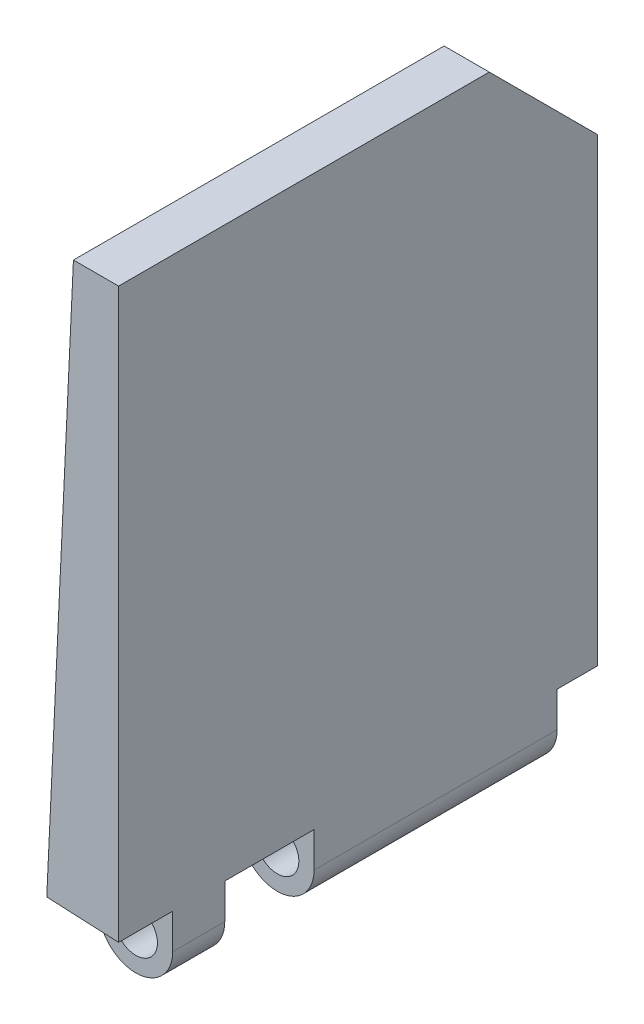
ISO-10303-21;
HEADER;
FILE_DESCRIPTION(('STEP AP214'),'2;1');
FILE_NAME('part.step','',(''),(''),'','','');
FILE_SCHEMA(('AUTOMOTIVE_DESIGN { 1 0 10303 214 1 1 1 1 }'));
ENDSEC;
DATA;
#1=APPLICATION_CONTEXT('core data for automotive mechanical design processes');
#2=APPLICATION_PROTOCOL_DEFINITION('international standard','automotive_design',2000,#1);
#3=PRODUCT_CONTEXT('',#1,'mechanical');
#4=PRODUCT('Part','Part','',(#3));
#5=PRODUCT_RELATED_PRODUCT_CATEGORY('part','',(#4));
#6=PRODUCT_DEFINITION_FORMATION('','',#4);
#7=PRODUCT_DEFINITION_CONTEXT('part definition',#1,'design');
#8=PRODUCT_DEFINITION('design','',#6,#7);
#9=PRODUCT_DEFINITION_SHAPE('','',#8);
#10=(LENGTH_UNIT() NAMED_UNIT(*) SI_UNIT(.MILLI.,.METRE.));
#11=(NAMED_UNIT(*) PLANE_ANGLE_UNIT() SI_UNIT($,.RADIAN.));
#12=(NAMED_UNIT(*) SI_UNIT($,.STERADIAN.) SOLID_ANGLE_UNIT());
#13=UNCERTAINTY_MEASURE_WITH_UNIT(LENGTH_MEASURE(1.E-05),#10,'distance_accuracy_value','');
#14=(GEOMETRIC_REPRESENTATION_CONTEXT(3) GLOBAL_UNCERTAINTY_ASSIGNED_CONTEXT((#13)) GLOBAL_UNIT_ASSIGNED_CONTEXT((#10,
#11,#12)) REPRESENTATION_CONTEXT('',''));
#15=CARTESIAN_POINT('',(0.,0.,0.));
#16=DIRECTION('',(0.,0.,1.));
#17=DIRECTION('',(1.,0.,0.));
#18=AXIS2_PLACEMENT_3D('',#15,#16,#17);
#19=CARTESIAN_POINT('',(-5.9368100641537,148.296821956492,-22.52));
#20=DIRECTION('',(0.,0.,-1.));
#21=DIRECTION('',(1.,0.,0.));
#22=AXIS2_PLACEMENT_3D('',#19,#20,#21);
#23=CYLINDRICAL_SURFACE('',#22,1.73219883235693);
#24=CARTESIAN_POINT('',(-5.9368100641537,148.296821956492,-31.7169488797652));
#25=DIRECTION('',(0.,0.,1.));
#26=DIRECTION('',(1.,0.,0.));
#27=AXIS2_PLACEMENT_3D('',#24,#25,#26);
#28=CIRCLE('',#27,1.73219883235693);
#29=CARTESIAN_POINT('',(-4.20461123179677,148.296821956492,-31.7169488797652));
#30=VERTEX_POINT('',#29);
#31=CARTESIAN_POINT('',(-7.66707712949073,148.378606291354,-31.7169488797652));
#32=VERTEX_POINT('',#31);
#33=EDGE_CURVE('E171',#30,#32,#28,.F.);
#34=ORIENTED_EDGE('',*,*,#33,.T.);
#35=DIRECTION('',(0.,0.,-1.));
#36=VECTOR('',#35,1.);
#37=CARTESIAN_POINT('',(-7.66707712949072,148.378606291354,-22.52));
#38=LINE('',#37,#36);
#39=CARTESIAN_POINT('',(-7.66707712949073,148.378606291354,-43.1553405109939));
#40=VERTEX_POINT('',#39);
#41=EDGE_CURVE('E204',#32,#40,#38,.T.);
#42=ORIENTED_EDGE('',*,*,#41,.T.);
#43=CARTESIAN_POINT('',(-5.9368100641537,148.296821956492,-43.1553405109939));
#44=DIRECTION('',(0.,0.,-1.));
#45=DIRECTION('',(0.,1.,0.));
#46=AXIS2_PLACEMENT_3D('',#43,#44,#45);
#47=CIRCLE('',#46,1.73219883235693);
#48=CARTESIAN_POINT('',(-4.20461123179677,148.296821956492,-43.1553405109939));
#49=VERTEX_POINT('',#48);
#50=EDGE_CURVE('E188',#40,#49,#47,.F.);
#51=ORIENTED_EDGE('',*,*,#50,.T.);
#52=DIRECTION('',(0.,0.,-1.));
#53=VECTOR('',#52,1.);
#54=CARTESIAN_POINT('',(-4.20461123179677,148.296821956492,-22.52));
#55=LINE('',#54,#53);
#56=EDGE_CURVE('E199',#30,#49,#55,.T.);
#57=ORIENTED_EDGE('',*,*,#56,.F.);
#58=EDGE_LOOP('',(#34,#42,#51,#57));
#59=FACE_BOUND('',#58,.T.);
#60=ADVANCED_FACE('F30',(#59),#23,.T.);
#61=CARTESIAN_POINT('',(-5.9368100641537,148.296821956492,-25.0631857722265));
#62=DIRECTION('',(0.,0.,1.));
#63=DIRECTION('',(1.,0.,0.));
#64=AXIS2_PLACEMENT_3D('',#61,#62,#63);
#65=CIRCLE('',#64,1.73219883235693);
#66=CARTESIAN_POINT('',(-4.20461123179677,148.296821956492,-25.0631857722265));
#67=VERTEX_POINT('',#66);
#68=CARTESIAN_POINT('',(-7.66707712949073,148.378606291354,-25.0631857722265));
#69=VERTEX_POINT('',#68);
#70=EDGE_CURVE('E158',#67,#69,#65,.F.);
#71=ORIENTED_EDGE('',*,*,#70,.T.);
#72=CARTESIAN_POINT('',(-7.66707712949073,148.378606291354,-27.5150907295179));
#73=VERTEX_POINT('',#72);
#74=EDGE_CURVE('E148',#69,#73,#38,.T.);
#75=ORIENTED_EDGE('',*,*,#74,.T.);
#76=CARTESIAN_POINT('',(-5.9368100641537,148.296821956492,-27.5150907295179));
#77=DIRECTION('',(0.,0.,-1.));
#78=DIRECTION('',(-1.,0.,0.));
#79=AXIS2_PLACEMENT_3D('',#76,#77,#78);
#80=CIRCLE('',#79,1.73219883235693);
#81=CARTESIAN_POINT('',(-4.20461123179677,148.296821956492,-27.5150907295179));
#82=VERTEX_POINT('',#81);
#83=EDGE_CURVE('E175',#73,#82,#80,.F.);
#84=ORIENTED_EDGE('',*,*,#83,.T.);
#85=EDGE_CURVE('E210',#67,#82,#55,.T.);
#86=ORIENTED_EDGE('',*,*,#85,.F.);
#87=EDGE_LOOP('',(#71,#75,#84,#86));
#88=FACE_BOUND('',#87,.T.);
#89=ADVANCED_FACE('F273',(#88),#23,.T.);
#90=CARTESIAN_POINT('',(-7.66707712949072,148.378606291354,-22.52));
#91=DIRECTION('',(-0.998884789099364,0.0472141727230132,0.));
#92=DIRECTION('',(-0.0472141727230132,-0.998884789099364,0.));
#93=AXIS2_PLACEMENT_3D('',#90,#91,#92);
#94=PLANE('',#93);
#95=DIRECTION('',(-0.0472141727230132,-0.998884789099364,0.));
#96=VECTOR('',#95,1.);
#97=CARTESIAN_POINT('',(-7.66707712949072,148.378606291354,-45.04));
#98=LINE('',#97,#96);
#99=CARTESIAN_POINT('',(-6.56899797373491,171.610074781681,-45.04));
#100=VERTEX_POINT('',#99);
#101=CARTESIAN_POINT('',(-7.58529279462923,150.108873356691,-45.04));
#102=VERTEX_POINT('',#101);
#103=EDGE_CURVE('E195',#100,#102,#98,.T.);
#104=ORIENTED_EDGE('',*,*,#103,.T.);
#105=DIRECTION('',(0.,0.,1.));
#106=VECTOR('',#105,1.);
#107=CARTESIAN_POINT('',(-7.58529279462923,150.108873356691,-43.1553405109939));
#108=LINE('',#107,#106);
#109=CARTESIAN_POINT('',(-7.58529279462923,150.108873356691,-43.1553405109939));
#110=VERTEX_POINT('',#109);
#111=EDGE_CURVE('E180',#102,#110,#108,.T.);
#112=ORIENTED_EDGE('',*,*,#111,.T.);
#113=DIRECTION('',(-0.0472141727230132,-0.998884789099364,0.));
#114=VECTOR('',#113,1.);
#115=CARTESIAN_POINT('',(-7.74886146435224,146.648339226017,-43.1553405109939));
#116=LINE('',#115,#114);
#117=EDGE_CURVE('E178',#110,#40,#116,.T.);
#118=ORIENTED_EDGE('',*,*,#117,.T.);
#119=ORIENTED_EDGE('',*,*,#41,.F.);
#120=DIRECTION('',(0.0472141727230132,0.998884789099364,0.));
#121=VECTOR('',#120,1.);
#122=CARTESIAN_POINT('',(-7.74886146435224,146.648339226017,-31.7169488797652));
#123=LINE('',#122,#121);
#124=CARTESIAN_POINT('',(-7.58529279462923,150.108873356691,-31.7169488797652));
#125=VERTEX_POINT('',#124);
#126=EDGE_CURVE('E162',#32,#125,#123,.T.);
#127=ORIENTED_EDGE('',*,*,#126,.T.);
#128=DIRECTION('',(0.,0.,1.));
#129=VECTOR('',#128,1.);
#130=CARTESIAN_POINT('',(-7.58529279462923,150.108873356691,-27.5150907295179));
#131=LINE('',#130,#129);
#132=CARTESIAN_POINT('',(-7.58529279462923,150.108873356691,-27.5150907295179));
#133=VERTEX_POINT('',#132);
#134=EDGE_CURVE('E165',#125,#133,#131,.T.);
#135=ORIENTED_EDGE('',*,*,#134,.T.);
#136=DIRECTION('',(-0.0472141727230132,-0.998884789099364,0.));
#137=VECTOR('',#136,1.);
#138=CARTESIAN_POINT('',(-7.74886146435224,146.648339226017,-27.5150907295179));
#139=LINE('',#138,#137);
#140=EDGE_CURVE('E160',#133,#73,#139,.T.);
#141=ORIENTED_EDGE('',*,*,#140,.T.);
#142=ORIENTED_EDGE('',*,*,#74,.F.);
#143=DIRECTION('',(0.0472141727230132,0.998884789099364,0.));
#144=VECTOR('',#143,1.);
#145=CARTESIAN_POINT('',(-7.74886146435224,146.648339226017,-25.0631857722265));
#146=LINE('',#145,#144);
#147=CARTESIAN_POINT('',(-7.58529279462923,150.108873356691,-25.0631857722265));
#148=VERTEX_POINT('',#147);
#149=EDGE_CURVE('E129',#69,#148,#146,.T.);
#150=ORIENTED_EDGE('',*,*,#149,.T.);
#151=DIRECTION('',(0.,0.,1.));
#152=VECTOR('',#151,1.);
#153=CARTESIAN_POINT('',(-7.58529279462923,150.108873356691,-25.0631857722265));
#154=LINE('',#153,#152);
#155=CARTESIAN_POINT('',(-7.58529279462922,150.108873356691,-22.52));
#156=VERTEX_POINT('',#155);
#157=EDGE_CURVE('E136',#148,#156,#154,.T.);
#158=ORIENTED_EDGE('',*,*,#157,.T.);
#159=DIRECTION('',(-0.0472141727230132,-0.998884789099364,0.));
#160=VECTOR('',#159,1.);
#161=CARTESIAN_POINT('',(-7.66707712949072,148.378606291354,-22.52));
#162=LINE('',#161,#160);
#163=CARTESIAN_POINT('',(-6.3288821965699,176.690074781681,-22.52));
#164=VERTEX_POINT('',#163);
#165=EDGE_CURVE('E197',#164,#156,#162,.T.);
#166=ORIENTED_EDGE('',*,*,#165,.F.);
#167=DIRECTION('',(0.,0.,-1.));
#168=VECTOR('',#167,1.);
#169=CARTESIAN_POINT('',(-6.3288821965699,176.690074781681,-22.52));
#170=LINE('',#169,#168);
#171=CARTESIAN_POINT('',(-6.3288821965699,176.690074781681,-39.96));
#172=VERTEX_POINT('',#171);
#173=EDGE_CURVE('E205',#164,#172,#170,.T.);
#174=ORIENTED_EDGE('',*,*,#173,.T.);
#175=DIRECTION('',(0.0334040828032297,0.706712164622935,0.70671216462294));
#176=VECTOR('',#175,1.);
#177=CARTESIAN_POINT('',(-6.58701893405534,171.228815043114,-45.4212597385672));
#178=LINE('',#177,#176);
#179=EDGE_CURVE('E233',#100,#172,#178,.T.);
#180=ORIENTED_EDGE('',*,*,#179,.F.);
#181=EDGE_LOOP('',(#104,#112,#118,#119,#127,#135,#141,#142,#150,#158,#166,#174,#180));
#182=FACE_BOUND('',#181,.T.);
#183=ADVANCED_FACE('F146',(#182),#94,.T.);
#184=CARTESIAN_POINT('',(-6.3288821965699,176.690074781681,-22.52));
#185=DIRECTION('',(0.,1.,0.));
#186=DIRECTION('',(0.,0.,-1.));
#187=AXIS2_PLACEMENT_3D('',#184,#185,#186);
#188=PLANE('',#187);
#189=ORIENTED_EDGE('',*,*,#173,.F.);
#190=DIRECTION('',(-1.,0.,0.));
#191=VECTOR('',#190,1.);
#192=CARTESIAN_POINT('',(-6.3288821965699,176.690074781681,-22.52));
#193=LINE('',#192,#191);
#194=CARTESIAN_POINT('',(-4.20461123179677,176.690074781681,-22.52));
#195=VERTEX_POINT('',#194);
#196=EDGE_CURVE('E194',#195,#164,#193,.T.);
#197=ORIENTED_EDGE('',*,*,#196,.F.);
#198=DIRECTION('',(0.,0.,-1.));
#199=VECTOR('',#198,1.);
#200=CARTESIAN_POINT('',(-4.20461123179677,176.690074781681,-22.52));
#201=LINE('',#200,#199);
#202=CARTESIAN_POINT('',(-4.20461123179677,176.690074781681,-39.96));
#203=VERTEX_POINT('',#202);
#204=EDGE_CURVE('E208',#195,#203,#201,.T.);
#205=ORIENTED_EDGE('',*,*,#204,.T.);
#206=DIRECTION('',(1.,0.,0.));
#207=VECTOR('',#206,1.);
#208=CARTESIAN_POINT('',(-4.20461123179677,176.690074781681,-39.96));
#209=LINE('',#208,#207);
#210=EDGE_CURVE('E38',#172,#203,#209,.T.);
#211=ORIENTED_EDGE('',*,*,#210,.F.);
#212=EDGE_LOOP('',(#189,#197,#205,#211));
#213=FACE_BOUND('',#212,.T.);
#214=ADVANCED_FACE('F237',(#213),#188,.T.);
#215=CARTESIAN_POINT('',(-4.20461123179677,176.690074781681,-22.52));
#216=DIRECTION('',(1.,0.,0.));
#217=DIRECTION('',(0.,0.,1.));
#218=AXIS2_PLACEMENT_3D('',#215,#216,#217);
#219=PLANE('',#218);
#220=ORIENTED_EDGE('',*,*,#204,.F.);
#221=DIRECTION('',(0.,1.,0.));
#222=VECTOR('',#221,1.);
#223=CARTESIAN_POINT('',(-4.20461123179677,176.690074781681,-22.52));
#224=LINE('',#223,#222);
#225=CARTESIAN_POINT('',(-4.20461123179677,149.94907906913,-22.52));
#226=VERTEX_POINT('',#225);
#227=EDGE_CURVE('E192',#226,#195,#224,.T.);
#228=ORIENTED_EDGE('',*,*,#227,.F.);
#229=DIRECTION('',(0.,0.,-1.));
#230=VECTOR('',#229,1.);
#231=CARTESIAN_POINT('',(-4.20461123179677,149.94907906913,-22.52));
#232=LINE('',#231,#230);
#233=CARTESIAN_POINT('',(-4.20461123179677,149.94907906913,-25.0631857722265));
#234=VERTEX_POINT('',#233);
#235=EDGE_CURVE('E135',#226,#234,#232,.T.);
#236=ORIENTED_EDGE('',*,*,#235,.T.);
#237=DIRECTION('',(0.,-1.,0.));
#238=VECTOR('',#237,1.);
#239=CARTESIAN_POINT('',(-4.20461123179677,176.690074781681,-25.0631857722265));
#240=LINE('',#239,#238);
#241=EDGE_CURVE('E131',#234,#67,#240,.T.);
#242=ORIENTED_EDGE('',*,*,#241,.T.);
#243=ORIENTED_EDGE('',*,*,#85,.T.);
#244=DIRECTION('',(0.,1.,0.));
#245=VECTOR('',#244,1.);
#246=CARTESIAN_POINT('',(-4.20461123179677,176.690074781681,-27.5150907295179));
#247=LINE('',#246,#245);
#248=CARTESIAN_POINT('',(-4.20461123179677,149.94907906913,-27.5150907295179));
#249=VERTEX_POINT('',#248);
#250=EDGE_CURVE('E222',#82,#249,#247,.T.);
#251=ORIENTED_EDGE('',*,*,#250,.T.);
#252=DIRECTION('',(0.,0.,-1.));
#253=VECTOR('',#252,1.);
#254=CARTESIAN_POINT('',(-4.20461123179677,149.94907906913,-22.52));
#255=LINE('',#254,#253);
#256=CARTESIAN_POINT('',(-4.20461123179677,149.94907906913,-31.7169488797652));
#257=VERTEX_POINT('',#256);
#258=EDGE_CURVE('E219',#249,#257,#255,.T.);
#259=ORIENTED_EDGE('',*,*,#258,.T.);
#260=DIRECTION('',(0.,-1.,0.));
#261=VECTOR('',#260,1.);
#262=CARTESIAN_POINT('',(-4.20461123179677,176.690074781681,-31.7169488797652));
#263=LINE('',#262,#261);
#264=EDGE_CURVE('E217',#257,#30,#263,.T.);
#265=ORIENTED_EDGE('',*,*,#264,.T.);
#266=ORIENTED_EDGE('',*,*,#56,.T.);
#267=DIRECTION('',(0.,1.,0.));
#268=VECTOR('',#267,1.);
#269=CARTESIAN_POINT('',(-4.20461123179677,176.690074781681,-43.1553405109939));
#270=LINE('',#269,#268);
#271=CARTESIAN_POINT('',(-4.20461123179677,149.94907906913,-43.1553405109939));
#272=VERTEX_POINT('',#271);
#273=EDGE_CURVE('E214',#49,#272,#270,.T.);
#274=ORIENTED_EDGE('',*,*,#273,.T.);
#275=DIRECTION('',(0.,0.,-1.));
#276=VECTOR('',#275,1.);
#277=CARTESIAN_POINT('',(-4.20461123179677,149.94907906913,-22.52));
#278=LINE('',#277,#276);
#279=CARTESIAN_POINT('',(-4.20461123179677,149.94907906913,-45.04));
#280=VERTEX_POINT('',#279);
#281=EDGE_CURVE('E185',#272,#280,#278,.T.);
#282=ORIENTED_EDGE('',*,*,#281,.T.);
#283=DIRECTION('',(0.,1.,0.));
#284=VECTOR('',#283,1.);
#285=CARTESIAN_POINT('',(-4.20461123179677,176.690074781681,-45.04));
#286=LINE('',#285,#284);
#287=CARTESIAN_POINT('',(-4.20461123179677,171.610074781681,-45.04));
#288=VERTEX_POINT('',#287);
#289=EDGE_CURVE('E191',#280,#288,#286,.T.);
#290=ORIENTED_EDGE('',*,*,#289,.T.);
#291=DIRECTION('',(0.,-0.707106781186545,-0.70710678118655));
#292=VECTOR('',#291,1.);
#293=CARTESIAN_POINT('',(-4.20461123179677,185.410074781681,-31.2399999999999));
#294=LINE('',#293,#292);
#295=EDGE_CURVE('E11',#203,#288,#294,.T.);
#296=ORIENTED_EDGE('',*,*,#295,.F.);
#297=EDGE_LOOP('',(#220,#228,#236,#242,#243,#251,#259,#265,#266,#274,#282,#290,#296));
#298=FACE_BOUND('',#297,.T.);
#299=ADVANCED_FACE('F239',(#298),#219,.T.);
#300=CARTESIAN_POINT('',(-5.9368100641537,148.296821956492,-22.52));
#301=DIRECTION('',(0.,0.,1.));
#302=DIRECTION('',(-1.,0.,0.));
#303=AXIS2_PLACEMENT_3D('',#300,#301,#302);
#304=PLANE('',#303);
#305=DIRECTION('',(0.998884789099364,-0.0472141727230132,0.));
#306=VECTOR('',#305,1.);
#307=CARTESIAN_POINT('',(-5.8550257292922,150.027089021829,-22.52));
#308=LINE('',#307,#306);
#309=EDGE_CURVE('E140',#156,#226,#308,.T.);
#310=ORIENTED_EDGE('',*,*,#309,.T.);
#311=ORIENTED_EDGE('',*,*,#227,.T.);
#312=ORIENTED_EDGE('',*,*,#196,.T.);
#313=ORIENTED_EDGE('',*,*,#165,.T.);
#314=EDGE_LOOP('',(#310,#311,#312,#313));
#315=FACE_BOUND('',#314,.T.);
#316=ADVANCED_FACE('F241',(#315),#304,.T.);
#317=CARTESIAN_POINT('',(-5.9368100641537,148.296821956492,-45.04));
#318=DIRECTION('',(0.,0.,1.));
#319=DIRECTION('',(-1.,0.,0.));
#320=AXIS2_PLACEMENT_3D('',#317,#318,#319);
#321=PLANE('',#320);
#322=ORIENTED_EDGE('',*,*,#289,.F.);
#323=DIRECTION('',(0.998884789099364,-0.0472141727230132,0.));
#324=VECTOR('',#323,1.);
#325=CARTESIAN_POINT('',(-5.8550257292922,150.027089021829,-45.04));
#326=LINE('',#325,#324);
#327=EDGE_CURVE('E203',#102,#280,#326,.T.);
#328=ORIENTED_EDGE('',*,*,#327,.F.);
#329=ORIENTED_EDGE('',*,*,#103,.F.);
#330=DIRECTION('',(-1.,0.,0.));
#331=VECTOR('',#330,1.);
#332=CARTESIAN_POINT('',(-6.3288821965699,171.610074781681,-45.04));
#333=LINE('',#332,#331);
#334=EDGE_CURVE('E227',#288,#100,#333,.T.);
#335=ORIENTED_EDGE('',*,*,#334,.F.);
#336=EDGE_LOOP('',(#322,#328,#329,#335));
#337=FACE_BOUND('',#336,.T.);
#338=ADVANCED_FACE('F245',(#337),#321,.F.);
#339=CARTESIAN_POINT('',(-4.2085638182907,146.481000383363,-43.1553405109939));
#340=DIRECTION('',(0.,0.,1.));
#341=DIRECTION('',(0.,1.,0.));
#342=AXIS2_PLACEMENT_3D('',#339,#340,#341);
#343=PLANE('',#342);
#344=CARTESIAN_POINT('',(-5.9368100641537,148.296821956492,-43.1553405109939));
#345=DIRECTION('',(0.,0.,1.));
#346=DIRECTION('',(1.,0.,0.));
#347=AXIS2_PLACEMENT_3D('',#344,#345,#346);
#348=CIRCLE('',#347,1.01600000000001);
#349=CARTESIAN_POINT('',(-4.9208100641537,148.296821956492,-43.1553405109939));
#350=VERTEX_POINT('',#349);
#351=EDGE_CURVE('E231',#350,#350,#348,.T.);
#352=ORIENTED_EDGE('',*,*,#351,.T.);
#353=EDGE_LOOP('',(#352));
#354=FACE_BOUND('',#353,.T.);
#355=ORIENTED_EDGE('',*,*,#50,.F.);
#356=ORIENTED_EDGE('',*,*,#117,.F.);
#357=DIRECTION('',(-0.998884789099364,0.0472141727230132,0.));
#358=VECTOR('',#357,1.);
#359=CARTESIAN_POINT('',(-4.04499514856769,149.941534514037,-43.1553405109939));
#360=LINE('',#359,#358);
#361=EDGE_CURVE('E183',#272,#110,#360,.T.);
#362=ORIENTED_EDGE('',*,*,#361,.F.);
#363=ORIENTED_EDGE('',*,*,#273,.F.);
#364=EDGE_LOOP('',(#355,#356,#362,#363));
#365=FACE_BOUND('',#364,.T.);
#366=ADVANCED_FACE('F255',(#354,#365),#343,.F.);
#367=CARTESIAN_POINT('',(-4.04499514856769,149.941534514037,-43.1553405109939));
#368=DIRECTION('',(0.0472141727230132,0.998884789099364,0.));
#369=DIRECTION('',(-0.998884789099364,0.0472141727230132,0.));
#370=AXIS2_PLACEMENT_3D('',#367,#368,#369);
#371=PLANE('',#370);
#372=ORIENTED_EDGE('',*,*,#281,.F.);
#373=ORIENTED_EDGE('',*,*,#361,.T.);
#374=ORIENTED_EDGE('',*,*,#111,.F.);
#375=ORIENTED_EDGE('',*,*,#327,.T.);
#376=EDGE_LOOP('',(#372,#373,#374,#375));
#377=FACE_BOUND('',#376,.T.);
#378=ADVANCED_FACE('F249',(#377),#371,.F.);
#379=CARTESIAN_POINT('',(-4.2085638182907,146.481000383363,-27.5150907295179));
#380=DIRECTION('',(0.,0.,1.));
#381=DIRECTION('',(-1.,0.,0.));
#382=AXIS2_PLACEMENT_3D('',#379,#380,#381);
#383=PLANE('',#382);
#384=CARTESIAN_POINT('',(-5.9368100641537,148.296821956492,-27.5150907295179));
#385=DIRECTION('',(0.,0.,-1.));
#386=DIRECTION('',(-1.,0.,0.));
#387=AXIS2_PLACEMENT_3D('',#384,#385,#386);
#388=CIRCLE('',#387,1.01600000000001);
#389=CARTESIAN_POINT('',(-4.9208100641537,148.296821956492,-27.5150907295179));
#390=VERTEX_POINT('',#389);
#391=EDGE_CURVE('E150',#390,#390,#388,.T.);
#392=ORIENTED_EDGE('',*,*,#391,.F.);
#393=EDGE_LOOP('',(#392));
#394=FACE_BOUND('',#393,.T.);
#395=ORIENTED_EDGE('',*,*,#83,.F.);
#396=ORIENTED_EDGE('',*,*,#140,.F.);
#397=DIRECTION('',(-0.998884789099364,0.0472141727230132,0.));
#398=VECTOR('',#397,1.);
#399=CARTESIAN_POINT('',(-4.04499514856769,149.941534514037,-27.5150907295179));
#400=LINE('',#399,#398);
#401=EDGE_CURVE('E169',#249,#133,#400,.T.);
#402=ORIENTED_EDGE('',*,*,#401,.F.);
#403=ORIENTED_EDGE('',*,*,#250,.F.);
#404=EDGE_LOOP('',(#395,#396,#402,#403));
#405=FACE_BOUND('',#404,.T.);
#406=ADVANCED_FACE('F270',(#394,#405),#383,.F.);
#407=CARTESIAN_POINT('',(-4.04499514856769,149.941534514037,-27.5150907295179));
#408=DIRECTION('',(0.0472141727230132,0.998884789099364,0.));
#409=DIRECTION('',(-0.998884789099364,0.0472141727230132,0.));
#410=AXIS2_PLACEMENT_3D('',#407,#408,#409);
#411=PLANE('',#410);
#412=ORIENTED_EDGE('',*,*,#258,.F.);
#413=ORIENTED_EDGE('',*,*,#401,.T.);
#414=ORIENTED_EDGE('',*,*,#134,.F.);
#415=DIRECTION('',(-0.998884789099364,0.0472141727230132,0.));
#416=VECTOR('',#415,1.);
#417=CARTESIAN_POINT('',(-4.04499514856769,149.941534514037,-31.7169488797652));
#418=LINE('',#417,#416);
#419=EDGE_CURVE('E168',#257,#125,#418,.T.);
#420=ORIENTED_EDGE('',*,*,#419,.F.);
#421=EDGE_LOOP('',(#412,#413,#414,#420));
#422=FACE_BOUND('',#421,.T.);
#423=ADVANCED_FACE('F268',(#422),#411,.F.);
#424=CARTESIAN_POINT('',(-4.2085638182907,146.481000383363,-31.7169488797652));
#425=DIRECTION('',(0.,0.,-1.));
#426=DIRECTION('',(1.,0.,0.));
#427=AXIS2_PLACEMENT_3D('',#424,#425,#426);
#428=PLANE('',#427);
#429=CARTESIAN_POINT('',(-5.9368100641537,148.296821956492,-31.7169488797652));
#430=DIRECTION('',(0.,0.,1.));
#431=DIRECTION('',(1.,0.,0.));
#432=AXIS2_PLACEMENT_3D('',#429,#430,#431);
#433=CIRCLE('',#432,1.01600000000001);
#434=CARTESIAN_POINT('',(-4.9208100641537,148.296821956492,-31.7169488797652));
#435=VERTEX_POINT('',#434);
#436=EDGE_CURVE('E153',#435,#435,#433,.T.);
#437=ORIENTED_EDGE('',*,*,#436,.F.);
#438=EDGE_LOOP('',(#437));
#439=FACE_BOUND('',#438,.T.);
#440=ORIENTED_EDGE('',*,*,#33,.F.);
#441=ORIENTED_EDGE('',*,*,#264,.F.);
#442=ORIENTED_EDGE('',*,*,#419,.T.);
#443=ORIENTED_EDGE('',*,*,#126,.F.);
#444=EDGE_LOOP('',(#440,#441,#442,#443));
#445=FACE_BOUND('',#444,.T.);
#446=ADVANCED_FACE('F262',(#439,#445),#428,.F.);
#447=CARTESIAN_POINT('',(-4.2085638182907,146.481000383363,-25.0631857722265));
#448=DIRECTION('',(0.,0.,-1.));
#449=DIRECTION('',(1.,0.,0.));
#450=AXIS2_PLACEMENT_3D('',#447,#448,#449);
#451=PLANE('',#450);
#452=CARTESIAN_POINT('',(-5.9368100641537,148.296821956492,-25.0631857722265));
#453=DIRECTION('',(0.,0.,1.));
#454=DIRECTION('',(1.,0.,0.));
#455=AXIS2_PLACEMENT_3D('',#452,#453,#454);
#456=CIRCLE('',#455,1.01600000000001);
#457=CARTESIAN_POINT('',(-4.9208100641537,148.296821956492,-25.0631857722265));
#458=VERTEX_POINT('',#457);
#459=EDGE_CURVE('E228',#458,#458,#456,.T.);
#460=ORIENTED_EDGE('',*,*,#459,.F.);
#461=EDGE_LOOP('',(#460));
#462=FACE_BOUND('',#461,.T.);
#463=ORIENTED_EDGE('',*,*,#70,.F.);
#464=ORIENTED_EDGE('',*,*,#241,.F.);
#465=DIRECTION('',(-0.998884789099364,0.0472141727230132,0.));
#466=VECTOR('',#465,1.);
#467=CARTESIAN_POINT('',(-4.04499514856769,149.941534514037,-25.0631857722265));
#468=LINE('',#467,#466);
#469=EDGE_CURVE('E124',#234,#148,#468,.T.);
#470=ORIENTED_EDGE('',*,*,#469,.T.);
#471=ORIENTED_EDGE('',*,*,#149,.F.);
#472=EDGE_LOOP('',(#463,#464,#470,#471));
#473=FACE_BOUND('',#472,.T.);
#474=ADVANCED_FACE('F127',(#462,#473),#451,.F.);
#475=CARTESIAN_POINT('',(-4.04499514856769,149.941534514037,-25.0631857722265));
#476=DIRECTION('',(0.0472141727230132,0.998884789099364,0.));
#477=DIRECTION('',(-0.998884789099364,0.0472141727230132,0.));
#478=AXIS2_PLACEMENT_3D('',#475,#476,#477);
#479=PLANE('',#478);
#480=ORIENTED_EDGE('',*,*,#235,.F.);
#481=ORIENTED_EDGE('',*,*,#309,.F.);
#482=ORIENTED_EDGE('',*,*,#157,.F.);
#483=ORIENTED_EDGE('',*,*,#469,.F.);
#484=EDGE_LOOP('',(#480,#481,#482,#483));
#485=FACE_BOUND('',#484,.T.);
#486=ADVANCED_FACE('F139',(#485),#479,.F.);
#487=CARTESIAN_POINT('',(-5.9368100641537,148.296821956492,-22.52));
#488=DIRECTION('',(0.,0.,-1.));
#489=DIRECTION('',(1.,0.,0.));
#490=AXIS2_PLACEMENT_3D('',#487,#488,#489);
#491=CYLINDRICAL_SURFACE('',#490,1.01600000000001);
#492=CARTESIAN_POINT('',(-4.9208100641537,148.296821956492,-25.0631857722265));
#493=CARTESIAN_POINT('',(-4.9208100641537,148.296821956492,-25.0887264488649));
#494=CARTESIAN_POINT('',(-4.9208100641537,148.296821956492,-25.1142671255034));
#495=CARTESIAN_POINT('',(-4.9208100641537,148.296821956492,-25.1653484787803));
#496=CARTESIAN_POINT('',(-4.9208100641537,148.296821956492,-25.1908891554188));
#497=CARTESIAN_POINT('',(-4.9208100641537,148.296821956492,-25.2419705086957));
#498=CARTESIAN_POINT('',(-4.9208100641537,148.296821956492,-25.2675111853341));
#499=CARTESIAN_POINT('',(-4.9208100641537,148.296821956492,-25.318592538611));
#500=CARTESIAN_POINT('',(-4.9208100641537,148.296821956492,-25.3441332152495));
#501=CARTESIAN_POINT('',(-4.9208100641537,148.296821956492,-25.3952145685264));
#502=CARTESIAN_POINT('',(-4.9208100641537,148.296821956492,-25.4207552451648));
#503=CARTESIAN_POINT('',(-4.9208100641537,148.296821956492,-25.4718365984417));
#504=CARTESIAN_POINT('',(-4.9208100641537,148.296821956492,-25.4973772750802));
#505=CARTESIAN_POINT('',(-4.9208100641537,148.296821956492,-25.5484586283571));
#506=CARTESIAN_POINT('',(-4.9208100641537,148.296821956492,-25.5739993049955));
#507=CARTESIAN_POINT('',(-4.9208100641537,148.296821956492,-25.6250806582724));
#508=CARTESIAN_POINT('',(-4.9208100641537,148.296821956492,-25.6506213349109));
#509=CARTESIAN_POINT('',(-4.9208100641537,148.296821956492,-25.7017026881878));
#510=CARTESIAN_POINT('',(-4.9208100641537,148.296821956492,-25.7272433648263));
#511=CARTESIAN_POINT('',(-4.9208100641537,148.296821956492,-25.7783247181032));
#512=CARTESIAN_POINT('',(-4.9208100641537,148.296821956492,-25.8038653947416));
#513=CARTESIAN_POINT('',(-4.9208100641537,148.296821956492,-25.8549467480185));
#514=CARTESIAN_POINT('',(-4.9208100641537,148.296821956492,-25.880487424657));
#515=CARTESIAN_POINT('',(-4.9208100641537,148.296821956492,-25.9315687779339));
#516=CARTESIAN_POINT('',(-4.9208100641537,148.296821956492,-25.9571094545723));
#517=CARTESIAN_POINT('',(-4.9208100641537,148.296821956492,-26.0081908078492));
#518=CARTESIAN_POINT('',(-4.9208100641537,148.296821956492,-26.0337314844877));
#519=CARTESIAN_POINT('',(-4.9208100641537,148.296821956492,-26.0848128377646));
#520=CARTESIAN_POINT('',(-4.9208100641537,148.296821956492,-26.110353514403));
#521=CARTESIAN_POINT('',(-4.9208100641537,148.296821956492,-26.16143486768));
#522=CARTESIAN_POINT('',(-4.9208100641537,148.296821956492,-26.1869755443184));
#523=CARTESIAN_POINT('',(-4.9208100641537,148.296821956492,-26.2380568975953));
#524=CARTESIAN_POINT('',(-4.9208100641537,148.296821956492,-26.2635975742338));
#525=CARTESIAN_POINT('',(-4.9208100641537,148.296821956492,-26.3146789275107));
#526=CARTESIAN_POINT('',(-4.9208100641537,148.296821956492,-26.3402196041491));
#527=CARTESIAN_POINT('',(-4.9208100641537,148.296821956492,-26.391300957426));
#528=CARTESIAN_POINT('',(-4.9208100641537,148.296821956492,-26.4168416340645));
#529=CARTESIAN_POINT('',(-4.9208100641537,148.296821956492,-26.4679229873414));
#530=CARTESIAN_POINT('',(-4.9208100641537,148.296821956492,-26.4934636639798));
#531=CARTESIAN_POINT('',(-4.9208100641537,148.296821956492,-26.5445450172567));
#532=CARTESIAN_POINT('',(-4.9208100641537,148.296821956492,-26.5700856938952));
#533=CARTESIAN_POINT('',(-4.9208100641537,148.296821956492,-26.6211670471721));
#534=CARTESIAN_POINT('',(-4.9208100641537,148.296821956492,-26.6467077238105));
#535=CARTESIAN_POINT('',(-4.9208100641537,148.296821956492,-26.6977890770874));
#536=CARTESIAN_POINT('',(-4.9208100641537,148.296821956492,-26.7233297537259));
#537=CARTESIAN_POINT('',(-4.9208100641537,148.296821956492,-26.7744111070028));
#538=CARTESIAN_POINT('',(-4.9208100641537,148.296821956492,-26.7999517836413));
#539=CARTESIAN_POINT('',(-4.9208100641537,148.296821956492,-26.8510331369182));
#540=CARTESIAN_POINT('',(-4.9208100641537,148.296821956492,-26.8765738135566));
#541=CARTESIAN_POINT('',(-4.9208100641537,148.296821956492,-26.9276551668335));
#542=CARTESIAN_POINT('',(-4.9208100641537,148.296821956492,-26.953195843472));
#543=CARTESIAN_POINT('',(-4.9208100641537,148.296821956492,-27.0042771967489));
#544=CARTESIAN_POINT('',(-4.9208100641537,148.296821956492,-27.0298178733873));
#545=CARTESIAN_POINT('',(-4.9208100641537,148.296821956492,-27.0808992266642));
#546=CARTESIAN_POINT('',(-4.9208100641537,148.296821956492,-27.1064399033027));
#547=CARTESIAN_POINT('',(-4.9208100641537,148.296821956492,-27.1575212565796));
#548=CARTESIAN_POINT('',(-4.9208100641537,148.296821956492,-27.1830619332181));
#549=CARTESIAN_POINT('',(-4.9208100641537,148.296821956492,-27.234143286495));
#550=CARTESIAN_POINT('',(-4.9208100641537,148.296821956492,-27.2596839631334));
#551=CARTESIAN_POINT('',(-4.9208100641537,148.296821956492,-27.3107653164103));
#552=CARTESIAN_POINT('',(-4.9208100641537,148.296821956492,-27.3363059930488));
#553=CARTESIAN_POINT('',(-4.9208100641537,148.296821956492,-27.3873873463257));
#554=CARTESIAN_POINT('',(-4.9208100641537,148.296821956492,-27.4129280229641));
#555=CARTESIAN_POINT('',(-4.9208100641537,148.296821956492,-27.464009376241));
#556=CARTESIAN_POINT('',(-4.9208100641537,148.296821956492,-27.4895500528795));
#557=CARTESIAN_POINT('',(-4.9208100641537,148.296821956492,-27.5150907295179));
#558=B_SPLINE_CURVE_WITH_KNOTS('',3,(#492,#493,#494,#495,#496,#497,#498,#499,#500,#501,#502,
#503,#504,#505,#506,#507,#508,#509,#510,#511,#512,#513,#514,#515,#516,#517,#518,#519,#520,#521,
#522,#523,#524,#525,#526,#527,#528,#529,#530,#531,#532,#533,#534,#535,#536,#537,#538,#539,#540,
#541,#542,#543,#544,#545,#546,#547,#548,#549,#550,#551,#552,#553,#554,#555,#556,#557),
.UNSPECIFIED.,.F.,.F.,(4,2,2,2,2,2,2,2,2,2,2,2,2,2,2,2,2,2,2,2,2,2,2,2,2,2,2,2,2,2,2,2,4),(0.,
0.0766220299153568,0.153244059830714,0.22986608974607,0.306488119661431,0.383110149576787,
0.459732179492144,0.536354209407505,0.612976239322861,0.689598269238218,0.766220299153575,
0.842842329068935,0.919464358984292,0.996086388899649,1.07270841881501,1.14933044873037,
1.22595247864572,1.30257450856108,1.37919653847644,1.4558185683918,1.53244059830715,
1.60906262822251,1.68568465813787,1.76230668805323,1.83892871796858,1.91555074788394,
1.9921727777993,2.06879480771466,2.14541683763001,2.22203886754537,2.29866089746073,
2.37528292737609,2.45190495729145),.UNSPECIFIED.);
#559=EDGE_CURVE('BSEAM307',#458,#390,#558,.T.);
#560=ORIENTED_EDGE('',*,*,#459,.T.);
#561=ORIENTED_EDGE('',*,*,#391,.T.);
#562=ORIENTED_EDGE('',*,*,#559,.T.);
#563=ORIENTED_EDGE('',*,*,#559,.F.);
#564=EDGE_LOOP('',(#560,#562,#561,#563));
#565=FACE_BOUND('',#564,.T.);
#566=ADVANCED_FACE('F307',(#565),#491,.F.);
#567=CARTESIAN_POINT('',(-4.9208100641537,148.296821956492,-43.1553405109939));
#568=CARTESIAN_POINT('',(-4.9208100641537,148.296821956492,-43.0361905981686));
#569=CARTESIAN_POINT('',(-4.9208100641537,148.296821956492,-42.9170406853433));
#570=CARTESIAN_POINT('',(-4.9208100641537,148.296821956492,-42.6787408596927));
#571=CARTESIAN_POINT('',(-4.9208100641537,148.296821956492,-42.5595909468674));
#572=CARTESIAN_POINT('',(-4.9208100641537,148.296821956492,-42.3212911212168));
#573=CARTESIAN_POINT('',(-4.9208100641537,148.296821956492,-42.2021412083915));
#574=CARTESIAN_POINT('',(-4.9208100641537,148.296821956492,-41.9638413827409));
#575=CARTESIAN_POINT('',(-4.9208100641537,148.296821956492,-41.8446914699156));
#576=CARTESIAN_POINT('',(-4.9208100641537,148.296821956492,-41.606391644265));
#577=CARTESIAN_POINT('',(-4.9208100641537,148.296821956492,-41.4872417314397));
#578=CARTESIAN_POINT('',(-4.9208100641537,148.296821956492,-41.2489419057891));
#579=CARTESIAN_POINT('',(-4.9208100641537,148.296821956492,-41.1297919929638));
#580=CARTESIAN_POINT('',(-4.9208100641537,148.296821956492,-40.8914921673132));
#581=CARTESIAN_POINT('',(-4.9208100641537,148.296821956492,-40.7723422544879));
#582=CARTESIAN_POINT('',(-4.9208100641537,148.296821956492,-40.5340424288373));
#583=CARTESIAN_POINT('',(-4.9208100641537,148.296821956492,-40.414892516012));
#584=CARTESIAN_POINT('',(-4.9208100641537,148.296821956492,-40.1765926903614));
#585=CARTESIAN_POINT('',(-4.9208100641537,148.296821956492,-40.0574427775362));
#586=CARTESIAN_POINT('',(-4.9208100641537,148.296821956492,-39.8191429518856));
#587=CARTESIAN_POINT('',(-4.9208100641537,148.296821956492,-39.6999930390603));
#588=CARTESIAN_POINT('',(-4.9208100641537,148.296821956492,-39.4616932134097));
#589=CARTESIAN_POINT('',(-4.9208100641537,148.296821956492,-39.3425433005844));
#590=CARTESIAN_POINT('',(-4.9208100641537,148.296821956492,-39.1042434749338));
#591=CARTESIAN_POINT('',(-4.9208100641537,148.296821956492,-38.9850935621085));
#592=CARTESIAN_POINT('',(-4.9208100641537,148.296821956492,-38.7467937364579));
#593=CARTESIAN_POINT('',(-4.9208100641537,148.296821956492,-38.6276438236326));
#594=CARTESIAN_POINT('',(-4.9208100641537,148.296821956492,-38.389343997982));
#595=CARTESIAN_POINT('',(-4.9208100641537,148.296821956492,-38.2701940851567));
#596=CARTESIAN_POINT('',(-4.9208100641537,148.296821956492,-38.0318942595061));
#597=CARTESIAN_POINT('',(-4.9208100641537,148.296821956492,-37.9127443466808));
#598=CARTESIAN_POINT('',(-4.9208100641537,148.296821956492,-37.6744445210302));
#599=CARTESIAN_POINT('',(-4.9208100641537,148.296821956492,-37.5552946082049));
#600=CARTESIAN_POINT('',(-4.9208100641537,148.296821956492,-37.3169947825543));
#601=CARTESIAN_POINT('',(-4.9208100641537,148.296821956492,-37.197844869729));
#602=CARTESIAN_POINT('',(-4.9208100641537,148.296821956492,-36.9595450440784));
#603=CARTESIAN_POINT('',(-4.9208100641537,148.296821956492,-36.8403951312531));
#604=CARTESIAN_POINT('',(-4.9208100641537,148.296821956492,-36.6020953056025));
#605=CARTESIAN_POINT('',(-4.9208100641537,148.296821956492,-36.4829453927772));
#606=CARTESIAN_POINT('',(-4.9208100641537,148.296821956492,-36.2446455671266));
#607=CARTESIAN_POINT('',(-4.9208100641537,148.296821956492,-36.1254956543013));
#608=CARTESIAN_POINT('',(-4.9208100641537,148.296821956492,-35.8871958286507));
#609=CARTESIAN_POINT('',(-4.9208100641537,148.296821956492,-35.7680459158254));
#610=CARTESIAN_POINT('',(-4.9208100641537,148.296821956492,-35.5297460901748));
#611=CARTESIAN_POINT('',(-4.9208100641537,148.296821956492,-35.4105961773495));
#612=CARTESIAN_POINT('',(-4.9208100641537,148.296821956492,-35.1722963516989));
#613=CARTESIAN_POINT('',(-4.9208100641537,148.296821956492,-35.0531464388736));
#614=CARTESIAN_POINT('',(-4.9208100641537,148.296821956492,-34.814846613223));
#615=CARTESIAN_POINT('',(-4.9208100641537,148.296821956492,-34.6956967003977));
#616=CARTESIAN_POINT('',(-4.9208100641537,148.296821956492,-34.4573968747471));
#617=CARTESIAN_POINT('',(-4.9208100641537,148.296821956492,-34.3382469619218));
#618=CARTESIAN_POINT('',(-4.9208100641537,148.296821956492,-34.0999471362712));
#619=CARTESIAN_POINT('',(-4.9208100641537,148.296821956492,-33.9807972234459));
#620=CARTESIAN_POINT('',(-4.9208100641537,148.296821956492,-33.7424973977953));
#621=CARTESIAN_POINT('',(-4.9208100641537,148.296821956492,-33.62334748497));
#622=CARTESIAN_POINT('',(-4.9208100641537,148.296821956492,-33.3850476593194));
#623=CARTESIAN_POINT('',(-4.9208100641537,148.296821956492,-33.2658977464941));
#624=CARTESIAN_POINT('',(-4.9208100641537,148.296821956492,-33.0275979208435));
#625=CARTESIAN_POINT('',(-4.9208100641537,148.296821956492,-32.9084480080182));
#626=CARTESIAN_POINT('',(-4.9208100641537,148.296821956492,-32.6701481823676));
#627=CARTESIAN_POINT('',(-4.9208100641537,148.296821956492,-32.5509982695423));
#628=CARTESIAN_POINT('',(-4.9208100641537,148.296821956492,-32.3126984438917));
#629=CARTESIAN_POINT('',(-4.9208100641537,148.296821956492,-32.1935485310664));
#630=CARTESIAN_POINT('',(-4.9208100641537,148.296821956492,-31.9552487054158));
#631=CARTESIAN_POINT('',(-4.9208100641537,148.296821956492,-31.8360987925905));
#632=CARTESIAN_POINT('',(-4.9208100641537,148.296821956492,-31.7169488797652));
#633=B_SPLINE_CURVE_WITH_KNOTS('',3,(#567,#568,#569,#570,#571,#572,#573,#574,#575,#576,#577,
#578,#579,#580,#581,#582,#583,#584,#585,#586,#587,#588,#589,#590,#591,#592,#593,#594,#595,#596,
#597,#598,#599,#600,#601,#602,#603,#604,#605,#606,#607,#608,#609,#610,#611,#612,#613,#614,#615,
#616,#617,#618,#619,#620,#621,#622,#623,#624,#625,#626,#627,#628,#629,#630,#631,#632),
.UNSPECIFIED.,.F.,.F.,(4,2,2,2,2,2,2,2,2,2,2,2,2,2,2,2,2,2,2,2,2,2,2,2,2,2,2,2,2,2,2,2,4),(0.,
0.357449738475901,0.714899476951802,1.07234921542769,1.42979895390359,1.78724869237949,
2.14469843085539,2.50214816933128,2.85959790780718,3.21704764628308,3.57449738475897,
3.93194712323487,4.28939686171077,4.64684660018666,5.00429633866256,5.36174607713846,
5.71919581561436,6.07664555409025,6.43409529256615,6.79154503104205,7.14899476951794,
7.50644450799384,7.86389424646974,8.22134398494563,8.57879372342153,8.93624346189743,
9.29369320037333,9.65114293884922,10.0085926773251,10.366042415801,10.7234921542769,
11.0809418927528,11.4383916312287),.UNSPECIFIED.);
#634=EDGE_CURVE('BSEAM309',#350,#435,#633,.T.);
#635=ORIENTED_EDGE('',*,*,#351,.F.);
#636=ORIENTED_EDGE('',*,*,#436,.T.);
#637=ORIENTED_EDGE('',*,*,#634,.T.);
#638=ORIENTED_EDGE('',*,*,#634,.F.);
#639=EDGE_LOOP('',(#635,#637,#636,#638));
#640=FACE_BOUND('',#639,.T.);
#641=ADVANCED_FACE('F309',(#640),#491,.F.);
#642=CARTESIAN_POINT('',(-5.9368100641537,171.610074781681,-45.04));
#643=DIRECTION('',(0.,0.70710678118655,-0.707106781186545));
#644=DIRECTION('',(0.,-0.707106781186545,-0.70710678118655));
#645=AXIS2_PLACEMENT_3D('',#642,#643,#644);
#646=PLANE('',#645);
#647=ORIENTED_EDGE('',*,*,#295,.T.);
#648=ORIENTED_EDGE('',*,*,#334,.T.);
#649=ORIENTED_EDGE('',*,*,#179,.T.);
#650=ORIENTED_EDGE('',*,*,#210,.T.);
#651=EDGE_LOOP('',(#647,#648,#649,#650));
#652=FACE_BOUND('',#651,.T.);
#653=ADVANCED_FACE('F32',(#652),#646,.T.);
#654=CLOSED_SHELL('',(#60,#89,#183,#214,#299,#316,#338,#366,#378,#406,#423,#446,#474,#486,#566,
#641,#653));
#655=MANIFOLD_SOLID_BREP('B2',#654);
#656=ADVANCED_BREP_SHAPE_REPRESENTATION('',(#18,#655),#14);
#657=SHAPE_DEFINITION_REPRESENTATION(#9,#656);
ENDSEC;
END-ISO-10303-21;
